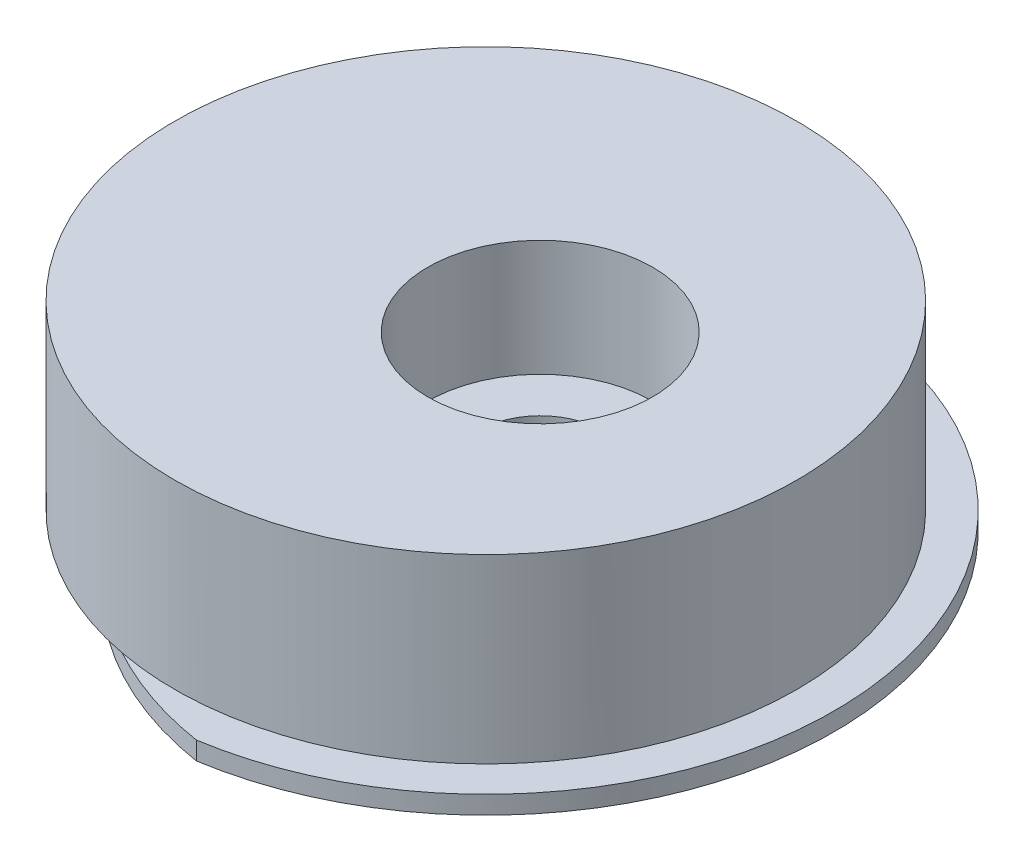
ISO-10303-21;
HEADER;
FILE_DESCRIPTION(('STEP AP214'),'2;1');
FILE_NAME('part.step','',(''),(''),'','','');
FILE_SCHEMA(('AUTOMOTIVE_DESIGN { 1 0 10303 214 1 1 1 1 }'));
ENDSEC;
DATA;
#1=APPLICATION_CONTEXT('core data for automotive mechanical design processes');
#2=APPLICATION_PROTOCOL_DEFINITION('international standard','automotive_design',2000,#1);
#3=PRODUCT_CONTEXT('',#1,'mechanical');
#4=PRODUCT('Part','Part','',(#3));
#5=PRODUCT_RELATED_PRODUCT_CATEGORY('part','',(#4));
#6=PRODUCT_DEFINITION_FORMATION('','',#4);
#7=PRODUCT_DEFINITION_CONTEXT('part definition',#1,'design');
#8=PRODUCT_DEFINITION('design','',#6,#7);
#9=PRODUCT_DEFINITION_SHAPE('','',#8);
#10=(LENGTH_UNIT() NAMED_UNIT(*) SI_UNIT(.MILLI.,.METRE.));
#11=(NAMED_UNIT(*) PLANE_ANGLE_UNIT() SI_UNIT($,.RADIAN.));
#12=(NAMED_UNIT(*) SI_UNIT($,.STERADIAN.) SOLID_ANGLE_UNIT());
#13=UNCERTAINTY_MEASURE_WITH_UNIT(LENGTH_MEASURE(1.E-05),#10,'distance_accuracy_value','');
#14=(GEOMETRIC_REPRESENTATION_CONTEXT(3) GLOBAL_UNCERTAINTY_ASSIGNED_CONTEXT((#13)) GLOBAL_UNIT_ASSIGNED_CONTEXT((#10,
#11,#12)) REPRESENTATION_CONTEXT('',''));
#15=CARTESIAN_POINT('',(0.,0.,0.));
#16=DIRECTION('',(0.,0.,1.));
#17=DIRECTION('',(1.,0.,0.));
#18=AXIS2_PLACEMENT_3D('',#15,#16,#17);
#19=CARTESIAN_POINT('',(0.,0.,0.));
#20=DIRECTION('',(0.,1.,0.));
#21=DIRECTION('',(0.,0.,1.));
#22=AXIS2_PLACEMENT_3D('',#19,#20,#21);
#23=CYLINDRICAL_SURFACE('',#22,1.7);
#24=CARTESIAN_POINT('',(0.,0.,0.));
#25=DIRECTION('',(0.,1.,0.));
#26=DIRECTION('',(0.,0.,1.));
#27=AXIS2_PLACEMENT_3D('',#24,#25,#26);
#28=CIRCLE('',#27,1.7);
#29=CARTESIAN_POINT('',(0.,0.,1.7));
#30=VERTEX_POINT('',#29);
#31=EDGE_CURVE('E102',#30,#30,#28,.T.);
#32=ORIENTED_EDGE('',*,*,#31,.F.);
#33=EDGE_LOOP('',(#32));
#34=FACE_BOUND('',#33,.T.);
#35=CARTESIAN_POINT('',(0.,2.3,0.));
#36=DIRECTION('',(0.,1.,0.));
#37=DIRECTION('',(0.,0.,1.));
#38=AXIS2_PLACEMENT_3D('',#35,#36,#37);
#39=CIRCLE('',#38,1.7);
#40=CARTESIAN_POINT('',(0.,2.3,1.7));
#41=VERTEX_POINT('',#40);
#42=EDGE_CURVE('E44',#41,#41,#39,.F.);
#43=ORIENTED_EDGE('',*,*,#42,.F.);
#44=EDGE_LOOP('',(#43));
#45=FACE_BOUND('',#44,.T.);
#46=ADVANCED_FACE('F41',(#34,#45),#23,.F.);
#47=CARTESIAN_POINT('',(-1.5,0.5,0.));
#48=DIRECTION('',(0.,-1.,0.));
#49=DIRECTION('',(0.,0.,-1.));
#50=AXIS2_PLACEMENT_3D('',#47,#48,#49);
#51=CYLINDRICAL_SURFACE('',#50,9.6);
#52=CARTESIAN_POINT('',(-1.5,0.,0.));
#53=DIRECTION('',(0.,1.,0.));
#54=DIRECTION('',(0.,0.,1.));
#55=AXIS2_PLACEMENT_3D('',#52,#53,#54);
#56=CIRCLE('',#55,9.6);
#57=CARTESIAN_POINT('',(0.,0.,-9.48208837756746));
#58=VERTEX_POINT('',#57);
#59=CARTESIAN_POINT('',(0.,0.,9.48208837756746));
#60=VERTEX_POINT('',#59);
#61=EDGE_CURVE('E79',#58,#60,#56,.F.);
#62=ORIENTED_EDGE('',*,*,#61,.F.);
#63=DIRECTION('',(0.,-1.,0.));
#64=VECTOR('',#63,1.);
#65=CARTESIAN_POINT('',(0.,0.5,-9.48208837756746));
#66=LINE('',#65,#64);
#67=CARTESIAN_POINT('',(0.,0.5,-9.48208837756746));
#68=VERTEX_POINT('',#67);
#69=EDGE_CURVE('E49',#68,#58,#66,.T.);
#70=ORIENTED_EDGE('',*,*,#69,.F.);
#71=CARTESIAN_POINT('',(-1.5,0.5,0.));
#72=DIRECTION('',(0.,1.,0.));
#73=DIRECTION('',(0.,0.,1.));
#74=AXIS2_PLACEMENT_3D('',#71,#72,#73);
#75=CIRCLE('',#74,9.6);
#76=CARTESIAN_POINT('',(0.,0.5,9.48208837756746));
#77=VERTEX_POINT('',#76);
#78=EDGE_CURVE('E78',#68,#77,#75,.F.);
#79=ORIENTED_EDGE('',*,*,#78,.T.);
#80=DIRECTION('',(0.,-1.,0.));
#81=VECTOR('',#80,1.);
#82=CARTESIAN_POINT('',(0.,0.5,9.48208837756746));
#83=LINE('',#82,#81);
#84=EDGE_CURVE('E77',#77,#60,#83,.T.);
#85=ORIENTED_EDGE('',*,*,#84,.T.);
#86=EDGE_LOOP('',(#62,#70,#79,#85));
#87=FACE_BOUND('',#86,.T.);
#88=ADVANCED_FACE('F43',(#87),#51,.T.);
#89=CARTESIAN_POINT('',(1.5,0.5,0.));
#90=DIRECTION('',(0.,-1.,0.));
#91=DIRECTION('',(0.,0.,-1.));
#92=AXIS2_PLACEMENT_3D('',#89,#90,#91);
#93=CYLINDRICAL_SURFACE('',#92,9.6);
#94=CARTESIAN_POINT('',(1.5,0.,0.));
#95=DIRECTION('',(0.,1.,0.));
#96=DIRECTION('',(0.,0.,1.));
#97=AXIS2_PLACEMENT_3D('',#94,#95,#96);
#98=CIRCLE('',#97,9.6);
#99=EDGE_CURVE('E83',#58,#60,#98,.T.);
#100=ORIENTED_EDGE('',*,*,#99,.T.);
#101=ORIENTED_EDGE('',*,*,#84,.F.);
#102=CARTESIAN_POINT('',(1.5,0.5,0.));
#103=DIRECTION('',(0.,1.,0.));
#104=DIRECTION('',(0.,0.,1.));
#105=AXIS2_PLACEMENT_3D('',#102,#103,#104);
#106=CIRCLE('',#105,9.6);
#107=CARTESIAN_POINT('',(-3.10489583333331,0.5,8.42347519519998));
#108=VERTEX_POINT('',#107);
#109=EDGE_CURVE('E65',#108,#77,#106,.T.);
#110=ORIENTED_EDGE('',*,*,#109,.F.);
#111=CARTESIAN_POINT('',(-3.10489583333331,0.5,-8.42347519519998));
#112=VERTEX_POINT('',#111);
#113=EDGE_CURVE('E97',#112,#108,#106,.T.);
#114=ORIENTED_EDGE('',*,*,#113,.F.);
#115=EDGE_CURVE('E85',#68,#112,#106,.T.);
#116=ORIENTED_EDGE('',*,*,#115,.F.);
#117=ORIENTED_EDGE('',*,*,#69,.T.);
#118=EDGE_LOOP('',(#100,#101,#110,#114,#116,#117));
#119=FACE_BOUND('',#118,.T.);
#120=ADVANCED_FACE('F86',(#119),#93,.T.);
#121=CARTESIAN_POINT('',(0.,0.5,0.));
#122=DIRECTION('',(0.,1.,0.));
#123=DIRECTION('',(0.,0.,1.));
#124=AXIS2_PLACEMENT_3D('',#121,#122,#123);
#125=PLANE('',#124);
#126=CARTESIAN_POINT('',(-1.5,0.5,0.));
#127=DIRECTION('',(0.,1.,0.));
#128=DIRECTION('',(0.,0.,1.));
#129=AXIS2_PLACEMENT_3D('',#126,#127,#128);
#130=CIRCLE('',#129,8.575);
#131=EDGE_CURVE('E11',#108,#112,#130,.T.);
#132=ORIENTED_EDGE('',*,*,#131,.F.);
#133=ORIENTED_EDGE('',*,*,#109,.T.);
#134=ORIENTED_EDGE('',*,*,#78,.F.);
#135=ORIENTED_EDGE('',*,*,#115,.T.);
#136=EDGE_LOOP('',(#132,#133,#134,#135));
#137=FACE_BOUND('',#136,.T.);
#138=ADVANCED_FACE('F170',(#137),#125,.T.);
#139=CARTESIAN_POINT('',(0.,0.,0.));
#140=DIRECTION('',(0.,1.,0.));
#141=DIRECTION('',(0.,0.,1.));
#142=AXIS2_PLACEMENT_3D('',#139,#140,#141);
#143=PLANE('',#142);
#144=ORIENTED_EDGE('',*,*,#31,.T.);
#145=EDGE_LOOP('',(#144));
#146=FACE_BOUND('',#145,.T.);
#147=CARTESIAN_POINT('',(0.,0.,-5.8));
#148=DIRECTION('',(0.,1.,0.));
#149=DIRECTION('',(0.,0.,1.));
#150=AXIS2_PLACEMENT_3D('',#147,#148,#149);
#151=CIRCLE('',#150,1.59);
#152=CARTESIAN_POINT('',(0.,0.,-4.21));
#153=VERTEX_POINT('',#152);
#154=EDGE_CURVE('E108',#153,#153,#151,.T.);
#155=ORIENTED_EDGE('',*,*,#154,.T.);
#156=EDGE_LOOP('',(#155));
#157=FACE_BOUND('',#156,.T.);
#158=CARTESIAN_POINT('',(0.,0.,5.8));
#159=DIRECTION('',(0.,1.,0.));
#160=DIRECTION('',(0.,0.,1.));
#161=AXIS2_PLACEMENT_3D('',#158,#159,#160);
#162=CIRCLE('',#161,1.29);
#163=CARTESIAN_POINT('',(0.,0.,7.09));
#164=VERTEX_POINT('',#163);
#165=EDGE_CURVE('E104',#164,#164,#162,.T.);
#166=ORIENTED_EDGE('',*,*,#165,.T.);
#167=EDGE_LOOP('',(#166));
#168=FACE_BOUND('',#167,.T.);
#169=ORIENTED_EDGE('',*,*,#61,.T.);
#170=ORIENTED_EDGE('',*,*,#99,.F.);
#171=EDGE_LOOP('',(#169,#170));
#172=FACE_BOUND('',#171,.T.);
#173=ADVANCED_FACE('F90',(#146,#157,#168,#172),#143,.F.);
#174=CARTESIAN_POINT('',(-1.5,0.5,0.));
#175=DIRECTION('',(0.,1.,0.));
#176=DIRECTION('',(0.,0.,1.));
#177=AXIS2_PLACEMENT_3D('',#174,#175,#176);
#178=PLANE('',#177);
#179=EDGE_CURVE('E55',#112,#108,#130,.T.);
#180=ORIENTED_EDGE('',*,*,#179,.F.);
#181=ORIENTED_EDGE('',*,*,#113,.T.);
#182=EDGE_LOOP('',(#180,#181));
#183=FACE_BOUND('',#182,.T.);
#184=ADVANCED_FACE('F156',(#183),#178,.F.);
#185=CARTESIAN_POINT('',(-1.5,5.5,0.));
#186=DIRECTION('',(0.,-1.,0.));
#187=DIRECTION('',(0.,0.,-1.));
#188=AXIS2_PLACEMENT_3D('',#185,#186,#187);
#189=CYLINDRICAL_SURFACE('',#188,8.575);
#190=CARTESIAN_POINT('',(-1.5,5.5,0.));
#191=DIRECTION('',(0.,1.,0.));
#192=DIRECTION('',(0.,0.,1.));
#193=AXIS2_PLACEMENT_3D('',#190,#191,#192);
#194=CIRCLE('',#193,8.575);
#195=CARTESIAN_POINT('',(-1.5,5.5,8.575));
#196=VERTEX_POINT('',#195);
#197=EDGE_CURVE('E92',#196,#196,#194,.T.);
#198=ORIENTED_EDGE('',*,*,#197,.F.);
#199=EDGE_LOOP('',(#198));
#200=FACE_BOUND('',#199,.T.);
#201=ORIENTED_EDGE('',*,*,#179,.T.);
#202=ORIENTED_EDGE('',*,*,#131,.T.);
#203=EDGE_LOOP('',(#201,#202));
#204=FACE_BOUND('',#203,.T.);
#205=ADVANCED_FACE('F158',(#200,#204),#189,.T.);
#206=CARTESIAN_POINT('',(-1.5,5.5,0.));
#207=DIRECTION('',(0.,1.,0.));
#208=DIRECTION('',(0.,0.,1.));
#209=AXIS2_PLACEMENT_3D('',#206,#207,#208);
#210=PLANE('',#209);
#211=CARTESIAN_POINT('',(0.,5.5,0.));
#212=DIRECTION('',(0.,1.,0.));
#213=DIRECTION('',(0.,0.,1.));
#214=AXIS2_PLACEMENT_3D('',#211,#212,#213);
#215=CIRCLE('',#214,3.1);
#216=CARTESIAN_POINT('',(0.,5.5,3.1));
#217=VERTEX_POINT('',#216);
#218=EDGE_CURVE('E114',#217,#217,#215,.T.);
#219=ORIENTED_EDGE('',*,*,#218,.F.);
#220=EDGE_LOOP('',(#219));
#221=FACE_BOUND('',#220,.T.);
#222=ORIENTED_EDGE('',*,*,#197,.T.);
#223=EDGE_LOOP('',(#222));
#224=FACE_BOUND('',#223,.T.);
#225=ADVANCED_FACE('F152',(#221,#224),#210,.T.);
#226=CARTESIAN_POINT('',(0.,4.,5.8));
#227=DIRECTION('',(0.,-1.,0.));
#228=DIRECTION('',(0.,0.,-1.));
#229=AXIS2_PLACEMENT_3D('',#226,#227,#228);
#230=CYLINDRICAL_SURFACE('',#229,1.29);
#231=CARTESIAN_POINT('',(0.,4.,5.8));
#232=DIRECTION('',(0.,1.,0.));
#233=DIRECTION('',(0.,0.,1.));
#234=AXIS2_PLACEMENT_3D('',#231,#232,#233);
#235=CIRCLE('',#234,1.29);
#236=CARTESIAN_POINT('',(0.,4.,7.09));
#237=VERTEX_POINT('',#236);
#238=EDGE_CURVE('E103',#237,#237,#235,.T.);
#239=ORIENTED_EDGE('',*,*,#238,.T.);
#240=EDGE_LOOP('',(#239));
#241=FACE_BOUND('',#240,.T.);
#242=ORIENTED_EDGE('',*,*,#165,.F.);
#243=EDGE_LOOP('',(#242));
#244=FACE_BOUND('',#243,.T.);
#245=ADVANCED_FACE('F146',(#241,#244),#230,.F.);
#246=CARTESIAN_POINT('',(0.,4.,5.8));
#247=DIRECTION('',(0.,1.,0.));
#248=DIRECTION('',(0.,0.,1.));
#249=AXIS2_PLACEMENT_3D('',#246,#247,#248);
#250=PLANE('',#249);
#251=ORIENTED_EDGE('',*,*,#238,.F.);
#252=EDGE_LOOP('',(#251));
#253=FACE_BOUND('',#252,.T.);
#254=ADVANCED_FACE('F150',(#253),#250,.F.);
#255=CARTESIAN_POINT('',(0.,4.,-5.8));
#256=DIRECTION('',(0.,-1.,0.));
#257=DIRECTION('',(0.,0.,-1.));
#258=AXIS2_PLACEMENT_3D('',#255,#256,#257);
#259=CYLINDRICAL_SURFACE('',#258,1.59);
#260=CARTESIAN_POINT('',(0.,4.,-5.8));
#261=DIRECTION('',(0.,1.,0.));
#262=DIRECTION('',(0.,0.,1.));
#263=AXIS2_PLACEMENT_3D('',#260,#261,#262);
#264=CIRCLE('',#263,1.59);
#265=CARTESIAN_POINT('',(0.,4.,-4.21));
#266=VERTEX_POINT('',#265);
#267=EDGE_CURVE('E100',#266,#266,#264,.T.);
#268=ORIENTED_EDGE('',*,*,#267,.T.);
#269=EDGE_LOOP('',(#268));
#270=FACE_BOUND('',#269,.T.);
#271=ORIENTED_EDGE('',*,*,#154,.F.);
#272=EDGE_LOOP('',(#271));
#273=FACE_BOUND('',#272,.T.);
#274=ADVANCED_FACE('F141',(#270,#273),#259,.F.);
#275=CARTESIAN_POINT('',(0.,4.,-5.8));
#276=DIRECTION('',(0.,1.,0.));
#277=DIRECTION('',(0.,0.,1.));
#278=AXIS2_PLACEMENT_3D('',#275,#276,#277);
#279=PLANE('',#278);
#280=ORIENTED_EDGE('',*,*,#267,.F.);
#281=EDGE_LOOP('',(#280));
#282=FACE_BOUND('',#281,.T.);
#283=ADVANCED_FACE('F136',(#282),#279,.F.);
#284=CARTESIAN_POINT('',(0.,2.3,0.));
#285=DIRECTION('',(0.,1.,0.));
#286=DIRECTION('',(0.,0.,1.));
#287=AXIS2_PLACEMENT_3D('',#284,#285,#286);
#288=PLANE('',#287);
#289=CARTESIAN_POINT('',(0.,2.3,0.));
#290=DIRECTION('',(0.,1.,0.));
#291=DIRECTION('',(0.,0.,1.));
#292=AXIS2_PLACEMENT_3D('',#289,#290,#291);
#293=CIRCLE('',#292,3.1);
#294=CARTESIAN_POINT('',(0.,2.3,3.1));
#295=VERTEX_POINT('',#294);
#296=EDGE_CURVE('E117',#295,#295,#293,.T.);
#297=ORIENTED_EDGE('',*,*,#296,.T.);
#298=EDGE_LOOP('',(#297));
#299=FACE_BOUND('',#298,.T.);
#300=ORIENTED_EDGE('',*,*,#42,.T.);
#301=EDGE_LOOP('',(#300));
#302=FACE_BOUND('',#301,.T.);
#303=ADVANCED_FACE('F123',(#299,#302),#288,.T.);
#304=CARTESIAN_POINT('',(0.,2.3,0.));
#305=DIRECTION('',(0.,1.,0.));
#306=DIRECTION('',(0.,0.,1.));
#307=AXIS2_PLACEMENT_3D('',#304,#305,#306);
#308=CYLINDRICAL_SURFACE('',#307,3.1);
#309=ORIENTED_EDGE('',*,*,#296,.F.);
#310=EDGE_LOOP('',(#309));
#311=FACE_BOUND('',#310,.T.);
#312=ORIENTED_EDGE('',*,*,#218,.T.);
#313=EDGE_LOOP('',(#312));
#314=FACE_BOUND('',#313,.T.);
#315=ADVANCED_FACE('F138',(#311,#314),#308,.F.);
#316=CLOSED_SHELL('',(#46,#88,#120,#138,#173,#184,#205,#225,#245,#254,#274,#283,#303,#315));
#317=MANIFOLD_SOLID_BREP('B2',#316);
#318=ADVANCED_BREP_SHAPE_REPRESENTATION('',(#18,#317),#14);
#319=SHAPE_DEFINITION_REPRESENTATION(#9,#318);
ENDSEC;
END-ISO-10303-21;
